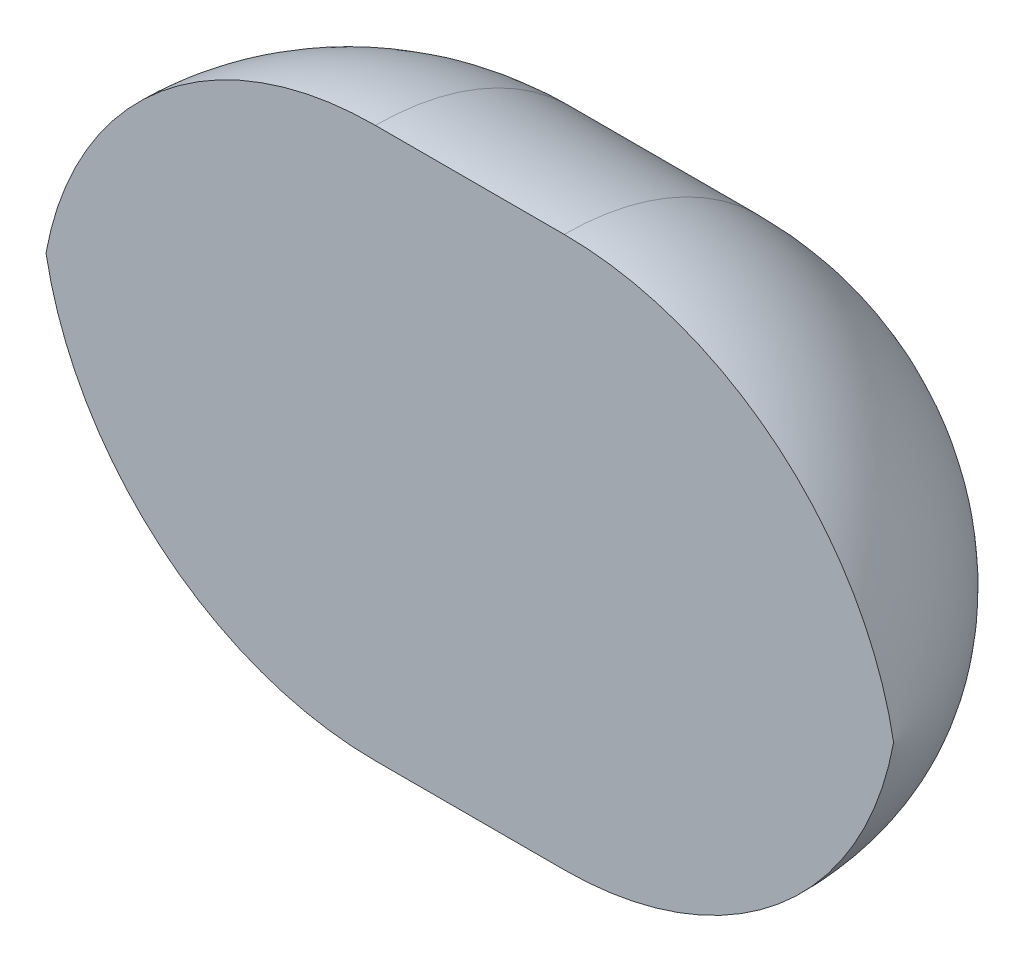
ISO-10303-21;
HEADER;
FILE_DESCRIPTION(('STEP AP214'),'2;1');
FILE_NAME('part.step','',(''),(''),'','','');
FILE_SCHEMA(('AUTOMOTIVE_DESIGN { 1 0 10303 214 1 1 1 1 }'));
ENDSEC;
DATA;
#1=APPLICATION_CONTEXT('core data for automotive mechanical design processes');
#2=APPLICATION_PROTOCOL_DEFINITION('international standard','automotive_design',2000,#1);
#3=PRODUCT_CONTEXT('',#1,'mechanical');
#4=PRODUCT('Part','Part','',(#3));
#5=PRODUCT_RELATED_PRODUCT_CATEGORY('part','',(#4));
#6=PRODUCT_DEFINITION_FORMATION('','',#4);
#7=PRODUCT_DEFINITION_CONTEXT('part definition',#1,'design');
#8=PRODUCT_DEFINITION('design','',#6,#7);
#9=PRODUCT_DEFINITION_SHAPE('','',#8);
#10=(LENGTH_UNIT() NAMED_UNIT(*) SI_UNIT(.MILLI.,.METRE.));
#11=(NAMED_UNIT(*) PLANE_ANGLE_UNIT() SI_UNIT($,.RADIAN.));
#12=(NAMED_UNIT(*) SI_UNIT($,.STERADIAN.) SOLID_ANGLE_UNIT());
#13=UNCERTAINTY_MEASURE_WITH_UNIT(LENGTH_MEASURE(1.E-05),#10,'distance_accuracy_value','');
#14=(GEOMETRIC_REPRESENTATION_CONTEXT(3) GLOBAL_UNCERTAINTY_ASSIGNED_CONTEXT((#13)) GLOBAL_UNIT_ASSIGNED_CONTEXT((#10,
#11,#12)) REPRESENTATION_CONTEXT('',''));
#15=CARTESIAN_POINT('',(0.,0.,0.));
#16=DIRECTION('',(0.,0.,1.));
#17=DIRECTION('',(1.,0.,0.));
#18=AXIS2_PLACEMENT_3D('',#15,#16,#17);
#19=CARTESIAN_POINT('',(-36.9100046124234,9.79289006761931,0.890000000000002));
#20=DIRECTION('',(0.,-1.,0.));
#21=DIRECTION('',(0.,0.,-1.));
#22=AXIS2_PLACEMENT_3D('',#19,#20,#21);
#23=CIRCLE('',#22,5.);
#24=TRIMMED_CURVE('',#23,(PARAMETER_VALUE(-1.39184270805472)),
(PARAMETER_VALUE(1.39184270805472)),.T.,.PARAMETER.);
#25=CARTESIAN_POINT('',(-36.9100046124234,9.79289006761931,0.));
#26=DIRECTION('',(1.,0.,0.));
#27=AXIS1_PLACEMENT('',#25,#26);
#28=SURFACE_OF_REVOLUTION('',#24,#27);
#29=CARTESIAN_POINT('',(-36.9100046124234,9.79289006761931,0.));
#30=DIRECTION('',(1.,0.,0.));
#31=DIRECTION('',(0.,0.,-1.));
#32=AXIS2_PLACEMENT_3D('',#29,#30,#31);
#33=CIRCLE('',#32,4.11);
#34=CARTESIAN_POINT('',(-36.9100046124234,5.68289006761931,0.));
#35=VERTEX_POINT('',#34);
#36=CARTESIAN_POINT('',(-36.9100046124234,13.9028900676193,0.));
#37=VERTEX_POINT('',#36);
#38=EDGE_CURVE('E11',#35,#37,#33,.T.);
#39=ORIENTED_EDGE('',*,*,#38,.T.);
#40=CARTESIAN_POINT('',(-36.9100046124234,8.90289006761931,0.));
#41=DIRECTION('',(0.,0.,1.));
#42=DIRECTION('',(1.,0.,0.));
#43=AXIS2_PLACEMENT_3D('',#40,#41,#42);
#44=CIRCLE('',#43,5.);
#45=CARTESIAN_POINT('',(-31.9898521757604,9.79289006761931,0.));
#46=VERTEX_POINT('',#45);
#47=EDGE_CURVE('E47',#46,#37,#44,.T.);
#48=ORIENTED_EDGE('',*,*,#47,.F.);
#49=CARTESIAN_POINT('',(-36.9100046124234,10.6828900676193,0.));
#50=DIRECTION('',(0.,0.,-1.));
#51=DIRECTION('',(1.,0.,0.));
#52=AXIS2_PLACEMENT_3D('',#49,#50,#51);
#53=CIRCLE('',#52,5.);
#54=EDGE_CURVE('E67',#46,#35,#53,.T.);
#55=ORIENTED_EDGE('',*,*,#54,.T.);
#56=EDGE_LOOP('',(#39,#48,#55));
#57=FACE_BOUND('',#56,.T.);
#58=ADVANCED_FACE('F33',(#57),#28,.T.);
#59=CARTESIAN_POINT('',(-31.9898521757604,9.79289006761931,0.));
#60=DIRECTION('',(1.,0.,0.));
#61=DIRECTION('',(0.,0.,-1.));
#62=AXIS2_PLACEMENT_3D('',#59,#60,#61);
#63=CYLINDRICAL_SURFACE('',#62,4.11);
#64=CARTESIAN_POINT('',(-39.7300046124234,9.79289006761931,0.));
#65=DIRECTION('',(1.,0.,0.));
#66=DIRECTION('',(0.,0.,-1.));
#67=AXIS2_PLACEMENT_3D('',#64,#65,#66);
#68=CIRCLE('',#67,4.11);
#69=CARTESIAN_POINT('',(-39.7300046124234,5.68289006761931,0.));
#70=VERTEX_POINT('',#69);
#71=CARTESIAN_POINT('',(-39.7300046124234,13.9028900676193,0.));
#72=VERTEX_POINT('',#71);
#73=EDGE_CURVE('E41',#70,#72,#68,.T.);
#74=ORIENTED_EDGE('',*,*,#73,.T.);
#75=DIRECTION('',(-1.,0.,0.));
#76=VECTOR('',#75,1.);
#77=CARTESIAN_POINT('',(-36.9100046124234,13.9028900676193,0.));
#78=LINE('',#77,#76);
#79=EDGE_CURVE('E73',#37,#72,#78,.T.);
#80=ORIENTED_EDGE('',*,*,#79,.F.);
#81=ORIENTED_EDGE('',*,*,#38,.F.);
#82=DIRECTION('',(-1.,0.,0.));
#83=VECTOR('',#82,1.);
#84=CARTESIAN_POINT('',(-36.9100046124234,5.68289006761931,0.));
#85=LINE('',#84,#83);
#86=EDGE_CURVE('E79',#35,#70,#85,.T.);
#87=ORIENTED_EDGE('',*,*,#86,.T.);
#88=EDGE_LOOP('',(#74,#80,#81,#87));
#89=FACE_BOUND('',#88,.T.);
#90=ADVANCED_FACE('F35',(#89),#63,.T.);
#91=CARTESIAN_POINT('',(-39.7300046124234,9.79289006761931,0.890000000000002));
#92=DIRECTION('',(0.,-1.,0.));
#93=DIRECTION('',(0.,0.,-1.));
#94=AXIS2_PLACEMENT_3D('',#91,#92,#93);
#95=CIRCLE('',#94,5.);
#96=TRIMMED_CURVE('',#95,(PARAMETER_VALUE(-1.39184270805472)),
(PARAMETER_VALUE(1.39184270805472)),.T.,.PARAMETER.);
#97=CARTESIAN_POINT('',(-39.7300046124234,9.79289006761931,0.));
#98=DIRECTION('',(1.,0.,0.));
#99=AXIS1_PLACEMENT('',#97,#98);
#100=SURFACE_OF_REVOLUTION('',#96,#99);
#101=CARTESIAN_POINT('',(-39.7300046124234,8.90289006761931,0.));
#102=DIRECTION('',(0.,0.,1.));
#103=DIRECTION('',(1.,0.,0.));
#104=AXIS2_PLACEMENT_3D('',#101,#102,#103);
#105=CIRCLE('',#104,5.);
#106=CARTESIAN_POINT('',(-44.6501570490863,9.79289006761931,0.));
#107=VERTEX_POINT('',#106);
#108=EDGE_CURVE('E55',#72,#107,#105,.T.);
#109=ORIENTED_EDGE('',*,*,#108,.F.);
#110=ORIENTED_EDGE('',*,*,#73,.F.);
#111=CARTESIAN_POINT('',(-39.7300046124234,10.6828900676193,0.));
#112=DIRECTION('',(0.,0.,-1.));
#113=DIRECTION('',(1.,0.,0.));
#114=AXIS2_PLACEMENT_3D('',#111,#112,#113);
#115=CIRCLE('',#114,5.);
#116=EDGE_CURVE('E81',#70,#107,#115,.T.);
#117=ORIENTED_EDGE('',*,*,#116,.T.);
#118=EDGE_LOOP('',(#109,#110,#117));
#119=FACE_BOUND('',#118,.T.);
#120=ADVANCED_FACE('F83',(#119),#100,.T.);
#121=CARTESIAN_POINT('',(-36.9100046124234,10.6828900676193,0.));
#122=DIRECTION('',(0.,0.,-1.));
#123=DIRECTION('',(1.,0.,0.));
#124=AXIS2_PLACEMENT_3D('',#121,#122,#123);
#125=PLANE('',#124);
#126=ORIENTED_EDGE('',*,*,#54,.F.);
#127=ORIENTED_EDGE('',*,*,#47,.T.);
#128=ORIENTED_EDGE('',*,*,#79,.T.);
#129=ORIENTED_EDGE('',*,*,#108,.T.);
#130=ORIENTED_EDGE('',*,*,#116,.F.);
#131=ORIENTED_EDGE('',*,*,#86,.F.);
#132=EDGE_LOOP('',(#126,#127,#128,#129,#130,#131));
#133=FACE_BOUND('',#132,.T.);
#134=ADVANCED_FACE('F72',(#133),#125,.F.);
#135=CLOSED_SHELL('',(#58,#90,#120,#134));
#136=MANIFOLD_SOLID_BREP('B2',#135);
#137=ADVANCED_BREP_SHAPE_REPRESENTATION('',(#18,#136),#14);
#138=SHAPE_DEFINITION_REPRESENTATION(#9,#137);
ENDSEC;
END-ISO-10303-21;
